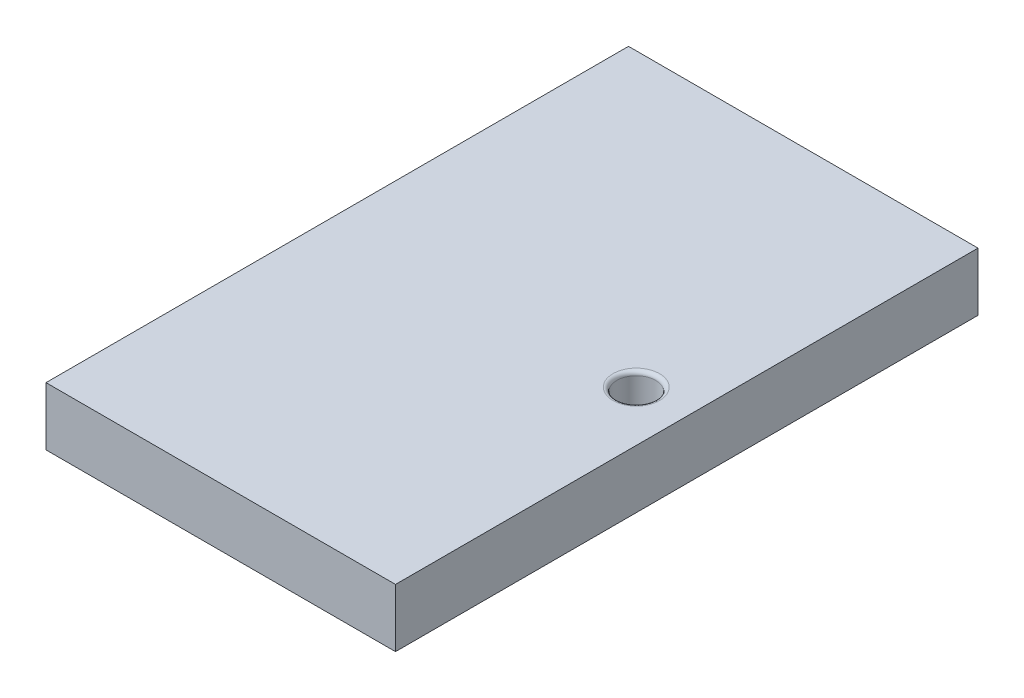
ISO-10303-21;
HEADER;
FILE_DESCRIPTION(('STEP AP214'),'2;1');
FILE_NAME('part.step','',(''),(''),'','','');
FILE_SCHEMA(('AUTOMOTIVE_DESIGN { 1 0 10303 214 1 1 1 1 }'));
ENDSEC;
DATA;
#1=APPLICATION_CONTEXT('core data for automotive mechanical design processes');
#2=APPLICATION_PROTOCOL_DEFINITION('international standard','automotive_design',2000,#1);
#3=PRODUCT_CONTEXT('',#1,'mechanical');
#4=PRODUCT('Part','Part','',(#3));
#5=PRODUCT_RELATED_PRODUCT_CATEGORY('part','',(#4));
#6=PRODUCT_DEFINITION_FORMATION('','',#4);
#7=PRODUCT_DEFINITION_CONTEXT('part definition',#1,'design');
#8=PRODUCT_DEFINITION('design','',#6,#7);
#9=PRODUCT_DEFINITION_SHAPE('','',#8);
#10=(LENGTH_UNIT() NAMED_UNIT(*) SI_UNIT(.MILLI.,.METRE.));
#11=(NAMED_UNIT(*) PLANE_ANGLE_UNIT() SI_UNIT($,.RADIAN.));
#12=(NAMED_UNIT(*) SI_UNIT($,.STERADIAN.) SOLID_ANGLE_UNIT());
#13=UNCERTAINTY_MEASURE_WITH_UNIT(LENGTH_MEASURE(1.E-05),#10,'distance_accuracy_value','');
#14=(GEOMETRIC_REPRESENTATION_CONTEXT(3) GLOBAL_UNCERTAINTY_ASSIGNED_CONTEXT((#13)) GLOBAL_UNIT_ASSIGNED_CONTEXT((#10,
#11,#12)) REPRESENTATION_CONTEXT('',''));
#15=CARTESIAN_POINT('',(0.,0.,0.));
#16=DIRECTION('',(0.,0.,1.));
#17=DIRECTION('',(1.,0.,0.));
#18=AXIS2_PLACEMENT_3D('',#15,#16,#17);
#19=CARTESIAN_POINT('',(0.,3.,0.));
#20=DIRECTION('',(0.,0.,-1.));
#21=DIRECTION('',(-1.,0.,0.));
#22=AXIS2_PLACEMENT_3D('',#19,#20,#21);
#23=PLANE('',#22);
#24=DIRECTION('',(1.,0.,0.));
#25=VECTOR('',#24,1.);
#26=CARTESIAN_POINT('',(0.,0.,0.));
#27=LINE('',#26,#25);
#28=CARTESIAN_POINT('',(0.,0.,0.));
#29=VERTEX_POINT('',#28);
#30=CARTESIAN_POINT('',(18.,0.,0.));
#31=VERTEX_POINT('',#30);
#32=EDGE_CURVE('E114',#29,#31,#27,.T.);
#33=ORIENTED_EDGE('',*,*,#32,.T.);
#34=DIRECTION('',(0.,-1.,0.));
#35=VECTOR('',#34,1.);
#36=CARTESIAN_POINT('',(18.,3.,0.));
#37=LINE('',#36,#35);
#38=CARTESIAN_POINT('',(18.,3.,0.));
#39=VERTEX_POINT('',#38);
#40=EDGE_CURVE('E103',#39,#31,#37,.T.);
#41=ORIENTED_EDGE('',*,*,#40,.F.);
#42=DIRECTION('',(1.,0.,0.));
#43=VECTOR('',#42,1.);
#44=CARTESIAN_POINT('',(0.,3.,0.));
#45=LINE('',#44,#43);
#46=CARTESIAN_POINT('',(0.,3.,0.));
#47=VERTEX_POINT('',#46);
#48=EDGE_CURVE('E94',#47,#39,#45,.T.);
#49=ORIENTED_EDGE('',*,*,#48,.F.);
#50=DIRECTION('',(0.,-1.,0.));
#51=VECTOR('',#50,1.);
#52=CARTESIAN_POINT('',(0.,3.,0.));
#53=LINE('',#52,#51);
#54=EDGE_CURVE('E60',#47,#29,#53,.T.);
#55=ORIENTED_EDGE('',*,*,#54,.T.);
#56=EDGE_LOOP('',(#33,#41,#49,#55));
#57=FACE_BOUND('',#56,.T.);
#58=ADVANCED_FACE('F43',(#57),#23,.F.);
#59=CARTESIAN_POINT('',(18.,3.,0.));
#60=DIRECTION('',(-1.,0.,0.));
#61=DIRECTION('',(0.,0.,1.));
#62=AXIS2_PLACEMENT_3D('',#59,#60,#61);
#63=PLANE('',#62);
#64=DIRECTION('',(0.,0.,-1.));
#65=VECTOR('',#64,1.);
#66=CARTESIAN_POINT('',(18.,0.,0.));
#67=LINE('',#66,#65);
#68=CARTESIAN_POINT('',(18.,0.,-30.));
#69=VERTEX_POINT('',#68);
#70=EDGE_CURVE('E100',#31,#69,#67,.T.);
#71=ORIENTED_EDGE('',*,*,#70,.T.);
#72=DIRECTION('',(0.,-1.,0.));
#73=VECTOR('',#72,1.);
#74=CARTESIAN_POINT('',(18.,3.,-30.));
#75=LINE('',#74,#73);
#76=CARTESIAN_POINT('',(18.,3.,-30.));
#77=VERTEX_POINT('',#76);
#78=EDGE_CURVE('E98',#77,#69,#75,.T.);
#79=ORIENTED_EDGE('',*,*,#78,.F.);
#80=DIRECTION('',(0.,0.,-1.));
#81=VECTOR('',#80,1.);
#82=CARTESIAN_POINT('',(18.,3.,0.));
#83=LINE('',#82,#81);
#84=EDGE_CURVE('E86',#39,#77,#83,.T.);
#85=ORIENTED_EDGE('',*,*,#84,.F.);
#86=ORIENTED_EDGE('',*,*,#40,.T.);
#87=EDGE_LOOP('',(#71,#79,#85,#86));
#88=FACE_BOUND('',#87,.T.);
#89=ADVANCED_FACE('F99',(#88),#63,.F.);
#90=CARTESIAN_POINT('',(0.,3.,-30.));
#91=DIRECTION('',(0.,0.,-1.));
#92=DIRECTION('',(-1.,0.,0.));
#93=AXIS2_PLACEMENT_3D('',#90,#91,#92);
#94=PLANE('',#93);
#95=DIRECTION('',(1.,0.,0.));
#96=VECTOR('',#95,1.);
#97=CARTESIAN_POINT('',(0.,0.,-30.));
#98=LINE('',#97,#96);
#99=CARTESIAN_POINT('',(0.,0.,-30.));
#100=VERTEX_POINT('',#99);
#101=EDGE_CURVE('E117',#100,#69,#98,.T.);
#102=ORIENTED_EDGE('',*,*,#101,.F.);
#103=DIRECTION('',(0.,-1.,0.));
#104=VECTOR('',#103,1.);
#105=CARTESIAN_POINT('',(0.,3.,-30.));
#106=LINE('',#105,#104);
#107=CARTESIAN_POINT('',(0.,3.,-30.));
#108=VERTEX_POINT('',#107);
#109=EDGE_CURVE('E74',#108,#100,#106,.T.);
#110=ORIENTED_EDGE('',*,*,#109,.F.);
#111=DIRECTION('',(1.,0.,0.));
#112=VECTOR('',#111,1.);
#113=CARTESIAN_POINT('',(0.,3.,-30.));
#114=LINE('',#113,#112);
#115=EDGE_CURVE('E93',#108,#77,#114,.T.);
#116=ORIENTED_EDGE('',*,*,#115,.T.);
#117=ORIENTED_EDGE('',*,*,#78,.T.);
#118=EDGE_LOOP('',(#102,#110,#116,#117));
#119=FACE_BOUND('',#118,.T.);
#120=ADVANCED_FACE('F105',(#119),#94,.T.);
#121=CARTESIAN_POINT('',(15.4,3.,-15.));
#122=DIRECTION('',(0.,-1.,0.));
#123=DIRECTION('',(0.,0.,-1.));
#124=AXIS2_PLACEMENT_3D('',#121,#122,#123);
#125=CYLINDRICAL_SURFACE('',#124,1.);
#126=CARTESIAN_POINT('',(15.4,2.8,-15.));
#127=DIRECTION('',(0.,1.,0.));
#128=DIRECTION('',(0.,0.,1.));
#129=AXIS2_PLACEMENT_3D('',#126,#127,#128);
#130=CIRCLE('',#129,1.);
#131=CARTESIAN_POINT('',(15.4,2.8,-14.));
#132=VERTEX_POINT('',#131);
#133=EDGE_CURVE('E52',#132,#132,#130,.T.);
#134=ORIENTED_EDGE('',*,*,#133,.T.);
#135=EDGE_LOOP('',(#134));
#136=FACE_BOUND('',#135,.T.);
#137=CARTESIAN_POINT('',(15.4,0.,-15.));
#138=DIRECTION('',(0.,1.,0.));
#139=DIRECTION('',(0.,0.,1.));
#140=AXIS2_PLACEMENT_3D('',#137,#138,#139);
#141=CIRCLE('',#140,1.);
#142=CARTESIAN_POINT('',(15.4,0.,-14.));
#143=VERTEX_POINT('',#142);
#144=EDGE_CURVE('E111',#143,#143,#141,.T.);
#145=ORIENTED_EDGE('',*,*,#144,.F.);
#146=EDGE_LOOP('',(#145));
#147=FACE_BOUND('',#146,.T.);
#148=ADVANCED_FACE('F127',(#136,#147),#125,.F.);
#149=CARTESIAN_POINT('',(0.,3.,0.));
#150=DIRECTION('',(-1.,0.,0.));
#151=DIRECTION('',(0.,0.,1.));
#152=AXIS2_PLACEMENT_3D('',#149,#150,#151);
#153=PLANE('',#152);
#154=DIRECTION('',(0.,0.,-1.));
#155=VECTOR('',#154,1.);
#156=CARTESIAN_POINT('',(0.,0.,0.));
#157=LINE('',#156,#155);
#158=EDGE_CURVE('E119',#29,#100,#157,.T.);
#159=ORIENTED_EDGE('',*,*,#158,.F.);
#160=ORIENTED_EDGE('',*,*,#54,.F.);
#161=DIRECTION('',(0.,0.,-1.));
#162=VECTOR('',#161,1.);
#163=CARTESIAN_POINT('',(0.,3.,0.));
#164=LINE('',#163,#162);
#165=EDGE_CURVE('E106',#47,#108,#164,.T.);
#166=ORIENTED_EDGE('',*,*,#165,.T.);
#167=ORIENTED_EDGE('',*,*,#109,.T.);
#168=EDGE_LOOP('',(#159,#160,#166,#167));
#169=FACE_BOUND('',#168,.T.);
#170=ADVANCED_FACE('F147',(#169),#153,.T.);
#171=CARTESIAN_POINT('',(0.,3.,0.));
#172=DIRECTION('',(0.,1.,0.));
#173=DIRECTION('',(0.,0.,1.));
#174=AXIS2_PLACEMENT_3D('',#171,#172,#173);
#175=PLANE('',#174);
#176=CARTESIAN_POINT('',(15.4,3.,-15.));
#177=DIRECTION('',(0.,1.,0.));
#178=DIRECTION('',(0.,0.,1.));
#179=AXIS2_PLACEMENT_3D('',#176,#177,#178);
#180=CIRCLE('',#179,1.2);
#181=CARTESIAN_POINT('',(15.4,3.,-13.8));
#182=VERTEX_POINT('',#181);
#183=EDGE_CURVE('E11',#182,#182,#180,.F.);
#184=ORIENTED_EDGE('',*,*,#183,.T.);
#185=EDGE_LOOP('',(#184));
#186=FACE_BOUND('',#185,.T.);
#187=ORIENTED_EDGE('',*,*,#48,.T.);
#188=ORIENTED_EDGE('',*,*,#84,.T.);
#189=ORIENTED_EDGE('',*,*,#115,.F.);
#190=ORIENTED_EDGE('',*,*,#165,.F.);
#191=EDGE_LOOP('',(#187,#188,#189,#190));
#192=FACE_BOUND('',#191,.T.);
#193=ADVANCED_FACE('F90',(#186,#192),#175,.T.);
#194=CARTESIAN_POINT('',(0.,0.,0.));
#195=DIRECTION('',(0.,1.,0.));
#196=DIRECTION('',(0.,0.,1.));
#197=AXIS2_PLACEMENT_3D('',#194,#195,#196);
#198=PLANE('',#197);
#199=ORIENTED_EDGE('',*,*,#144,.T.);
#200=EDGE_LOOP('',(#199));
#201=FACE_BOUND('',#200,.T.);
#202=ORIENTED_EDGE('',*,*,#32,.F.);
#203=ORIENTED_EDGE('',*,*,#158,.T.);
#204=ORIENTED_EDGE('',*,*,#101,.T.);
#205=ORIENTED_EDGE('',*,*,#70,.F.);
#206=EDGE_LOOP('',(#202,#203,#204,#205));
#207=FACE_BOUND('',#206,.T.);
#208=ADVANCED_FACE('F131',(#201,#207),#198,.F.);
#209=CARTESIAN_POINT('',(15.4,2.8,-15.));
#210=DIRECTION('',(0.,1.,0.));
#211=DIRECTION('',(0.,0.,1.));
#212=AXIS2_PLACEMENT_3D('',#209,#210,#211);
#213=TOROIDAL_SURFACE('',#212,1.2,0.2);
#214=ORIENTED_EDGE('',*,*,#183,.F.);
#215=EDGE_LOOP('',(#214));
#216=FACE_BOUND('',#215,.T.);
#217=ORIENTED_EDGE('',*,*,#133,.F.);
#218=EDGE_LOOP('',(#217));
#219=FACE_BOUND('',#218,.T.);
#220=ADVANCED_FACE('F45',(#216,#219),#213,.T.);
#221=CLOSED_SHELL('',(#58,#89,#120,#148,#170,#193,#208,#220));
#222=MANIFOLD_SOLID_BREP('B2',#221);
#223=ADVANCED_BREP_SHAPE_REPRESENTATION('',(#18,#222),#14);
#224=SHAPE_DEFINITION_REPRESENTATION(#9,#223);
ENDSEC;
END-ISO-10303-21;
